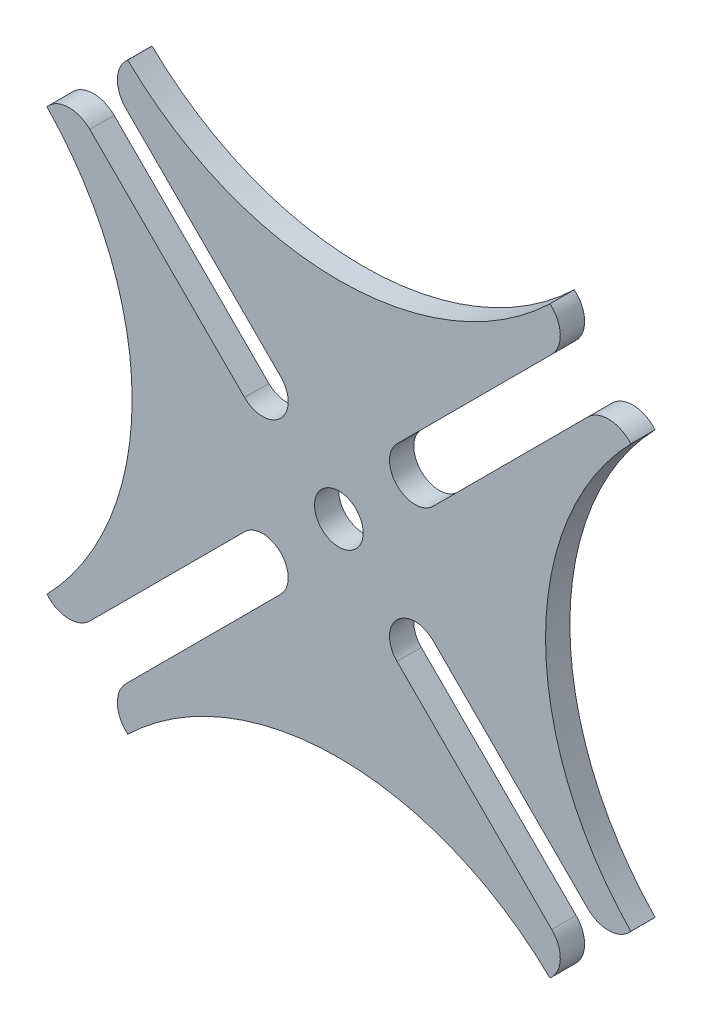
ISO-10303-21;
HEADER;
FILE_DESCRIPTION(('STEP AP214'),'2;1');
FILE_NAME('part.step','',(''),(''),'','','');
FILE_SCHEMA(('AUTOMOTIVE_DESIGN { 1 0 10303 214 1 1 1 1 }'));
ENDSEC;
DATA;
#1=APPLICATION_CONTEXT('core data for automotive mechanical design processes');
#2=APPLICATION_PROTOCOL_DEFINITION('international standard','automotive_design',2000,#1);
#3=PRODUCT_CONTEXT('',#1,'mechanical');
#4=PRODUCT('Part','Part','',(#3));
#5=PRODUCT_RELATED_PRODUCT_CATEGORY('part','',(#4));
#6=PRODUCT_DEFINITION_FORMATION('','',#4);
#7=PRODUCT_DEFINITION_CONTEXT('part definition',#1,'design');
#8=PRODUCT_DEFINITION('design','',#6,#7);
#9=PRODUCT_DEFINITION_SHAPE('','',#8);
#10=(LENGTH_UNIT() NAMED_UNIT(*) SI_UNIT(.MILLI.,.METRE.));
#11=(NAMED_UNIT(*) PLANE_ANGLE_UNIT() SI_UNIT($,.RADIAN.));
#12=(NAMED_UNIT(*) SI_UNIT($,.STERADIAN.) SOLID_ANGLE_UNIT());
#13=UNCERTAINTY_MEASURE_WITH_UNIT(LENGTH_MEASURE(1.E-05),#10,'distance_accuracy_value','');
#14=(GEOMETRIC_REPRESENTATION_CONTEXT(3) GLOBAL_UNCERTAINTY_ASSIGNED_CONTEXT((#13)) GLOBAL_UNIT_ASSIGNED_CONTEXT((#10,
#11,#12)) REPRESENTATION_CONTEXT('',''));
#15=CARTESIAN_POINT('',(0.,0.,0.));
#16=DIRECTION('',(0.,0.,1.));
#17=DIRECTION('',(1.,0.,0.));
#18=AXIS2_PLACEMENT_3D('',#15,#16,#17);
#19=CARTESIAN_POINT('',(105.,0.,5.));
#20=DIRECTION('',(0.,0.,1.));
#21=DIRECTION('',(1.,0.,0.));
#22=AXIS2_PLACEMENT_3D('',#19,#20,#21);
#23=PLANE('',#22);
#24=CARTESIAN_POINT('',(105.,0.,5.));
#25=DIRECTION('',(0.,0.,-1.));
#26=DIRECTION('',(1.,0.,0.));
#27=AXIS2_PLACEMENT_3D('',#24,#25,#26);
#28=CIRCLE('',#27,62.5);
#29=CARTESIAN_POINT('',(60.0266261974981,-43.4009867263457,5.));
#30=VERTEX_POINT('',#29);
#31=CARTESIAN_POINT('',(60.0266273466604,43.4009879171413,5.));
#32=VERTEX_POINT('',#31);
#33=EDGE_CURVE('E279',#30,#32,#28,.T.);
#34=ORIENTED_EDGE('',*,*,#33,.T.);
#35=CARTESIAN_POINT('',(55.4412378512341,39.5313363598,5.));
#36=DIRECTION('',(0.,0.,1.));
#37=DIRECTION('',(-1.,0.,0.));
#38=AXIS2_PLACEMENT_3D('',#35,#36,#37);
#39=CIRCLE('',#38,6.);
#40=CARTESIAN_POINT('',(51.1985971156337,43.7739769984381,5.));
#41=VERTEX_POINT('',#40);
#42=EDGE_CURVE('E147',#32,#41,#39,.T.);
#43=ORIENTED_EDGE('',*,*,#42,.T.);
#44=DIRECTION('',(-0.707106773106353,-0.707106789266742,0.));
#45=VECTOR('',#44,1.);
#46=CARTESIAN_POINT('',(19.3787923258478,11.9541714814347,5.));
#47=LINE('',#46,#45);
#48=CARTESIAN_POINT('',(19.3787923258478,11.9541714814347,5.));
#49=VERTEX_POINT('',#48);
#50=EDGE_CURVE('E342',#41,#49,#47,.T.);
#51=ORIENTED_EDGE('',*,*,#50,.T.);
#52=CARTESIAN_POINT('',(15.6664816821974,15.666482040243,5.));
#53=DIRECTION('',(0.,0.,-1.));
#54=DIRECTION('',(1.,0.,0.));
#55=AXIS2_PLACEMENT_3D('',#52,#53,#54);
#56=CIRCLE('',#55,5.24999999999995);
#57=CARTESIAN_POINT('',(11.9541710385471,19.3787925990513,5.));
#58=VERTEX_POINT('',#57);
#59=EDGE_CURVE('E361',#49,#58,#56,.T.);
#60=ORIENTED_EDGE('',*,*,#59,.T.);
#61=DIRECTION('',(0.707106773106353,0.707106789266742,0.));
#62=VECTOR('',#61,1.);
#63=CARTESIAN_POINT('',(11.9541710385471,19.3787925990513,5.));
#64=LINE('',#63,#62);
#65=CARTESIAN_POINT('',(43.773975828333,51.1985981160547,5.));
#66=VERTEX_POINT('',#65);
#67=EDGE_CURVE('E358',#58,#66,#64,.T.);
#68=ORIENTED_EDGE('',*,*,#67,.T.);
#69=CARTESIAN_POINT('',(39.5313350927325,55.4412387546928,5.));
#70=DIRECTION('',(0.,0.,1.));
#71=DIRECTION('',(1.,0.,0.));
#72=AXIS2_PLACEMENT_3D('',#69,#70,#71);
#73=CIRCLE('',#72,6.);
#74=CARTESIAN_POINT('',(43.4009865452783,60.0266283385571,5.));
#75=VERTEX_POINT('',#74);
#76=EDGE_CURVE('E360',#66,#75,#73,.T.);
#77=ORIENTED_EDGE('',*,*,#76,.T.);
#78=CARTESIAN_POINT('',(-2.24129753054683E-07,105.000000941604,5.));
#79=DIRECTION('',(0.,0.,-1.));
#80=DIRECTION('',(1.,0.,0.));
#81=AXIS2_PLACEMENT_3D('',#78,#79,#80);
#82=CIRCLE('',#81,62.4999991668067);
#83=CARTESIAN_POINT('',(-43.4009859439844,60.0266273256988,5.));
#84=VERTEX_POINT('',#83);
#85=EDGE_CURVE('E363',#75,#84,#82,.T.);
#86=ORIENTED_EDGE('',*,*,#85,.T.);
#87=CARTESIAN_POINT('',(-39.5313354453696,55.4412369368039,5.));
#88=DIRECTION('',(0.,0.,1.));
#89=DIRECTION('',(-1.,0.,0.));
#90=AXIS2_PLACEMENT_3D('',#87,#88,#89);
#91=CIRCLE('',#90,6.00000000000002);
#92=CARTESIAN_POINT('',(-43.7739760198867,51.1985961370824,5.));
#93=VERTEX_POINT('',#92);
#94=EDGE_CURVE('E369',#84,#93,#91,.T.);
#95=ORIENTED_EDGE('',*,*,#94,.T.);
#96=DIRECTION('',(0.707106789266742,-0.707106773106353,0.));
#97=VECTOR('',#96,1.);
#98=CARTESIAN_POINT('',(-11.9541705028833,19.3787913472965,5.));
#99=LINE('',#98,#97);
#100=CARTESIAN_POINT('',(-11.9541705028833,19.3787913472965,5.));
#101=VERTEX_POINT('',#100);
#102=EDGE_CURVE('E371',#93,#101,#99,.T.);
#103=ORIENTED_EDGE('',*,*,#102,.T.);
#104=CARTESIAN_POINT('',(-15.6664823982886,15.666482040243,5.));
#105=DIRECTION('',(0.,0.,-1.));
#106=DIRECTION('',(1.,0.,0.));
#107=AXIS2_PLACEMENT_3D('',#104,#105,#106);
#108=CIRCLE('',#107,5.25000000000032);
#109=CARTESIAN_POINT('',(-19.3787916205,11.9541700599957,5.));
#110=VERTEX_POINT('',#109);
#111=EDGE_CURVE('E373',#101,#110,#108,.T.);
#112=ORIENTED_EDGE('',*,*,#111,.T.);
#113=DIRECTION('',(-0.707106789266742,0.707106773106353,0.));
#114=VECTOR('',#113,1.);
#115=CARTESIAN_POINT('',(-19.3787916205,11.9541700599957,5.));
#116=LINE('',#115,#114);
#117=CARTESIAN_POINT('',(-51.1985970377725,43.7739747500507,5.));
#118=VERTEX_POINT('',#117);
#119=EDGE_CURVE('E375',#110,#118,#116,.T.);
#120=ORIENTED_EDGE('',*,*,#119,.T.);
#121=CARTESIAN_POINT('',(-55.4412376764107,39.5313340144503,5.));
#122=DIRECTION('',(0.,0.,1.));
#123=DIRECTION('',(1.,0.,0.));
#124=AXIS2_PLACEMENT_3D('',#121,#122,#123);
#125=CIRCLE('',#124,6.00000000000002);
#126=CARTESIAN_POINT('',(-60.0266261974981,43.4009867263457,5.));
#127=VERTEX_POINT('',#126);
#128=EDGE_CURVE('E377',#118,#127,#125,.T.);
#129=ORIENTED_EDGE('',*,*,#128,.T.);
#130=CARTESIAN_POINT('',(-105.,0.,5.));
#131=DIRECTION('',(0.,0.,-1.));
#132=DIRECTION('',(1.,0.,0.));
#133=AXIS2_PLACEMENT_3D('',#130,#131,#132);
#134=CIRCLE('',#133,62.5);
#135=CARTESIAN_POINT('',(-60.0266264046898,-43.4009869410438,5.));
#136=VERTEX_POINT('',#135);
#137=EDGE_CURVE('E379',#127,#136,#134,.T.);
#138=ORIENTED_EDGE('',*,*,#137,.T.);
#139=CARTESIAN_POINT('',(-55.4412368936445,-39.5313354022102,5.));
#140=DIRECTION('',(0.,0.,1.));
#141=DIRECTION('',(-1.,0.,0.));
#142=AXIS2_PLACEMENT_3D('',#139,#140,#141);
#143=CIRCLE('',#142,6.00000000000001);
#144=CARTESIAN_POINT('',(-51.198596158044,-43.7739760408483,5.));
#145=VERTEX_POINT('',#144);
#146=EDGE_CURVE('E381',#136,#145,#143,.T.);
#147=ORIENTED_EDGE('',*,*,#146,.T.);
#148=DIRECTION('',(0.707106773106353,0.707106789266742,0.));
#149=VECTOR('',#148,1.);
#150=CARTESIAN_POINT('',(-19.3787913682582,-11.954170523845,5.));
#151=LINE('',#150,#149);
#152=CARTESIAN_POINT('',(-19.3787913682582,-11.954170523845,5.));
#153=VERTEX_POINT('',#152);
#154=EDGE_CURVE('E383',#145,#153,#151,.T.);
#155=ORIENTED_EDGE('',*,*,#154,.T.);
#156=CARTESIAN_POINT('',(-15.6664811259639,-15.6664813241519,5.));
#157=DIRECTION('',(0.,0.,-1.));
#158=DIRECTION('',(1.,0.,0.));
#159=AXIS2_PLACEMENT_3D('',#156,#157,#158);
#160=CIRCLE('',#159,5.24999988696369);
#161=CARTESIAN_POINT('',(-11.9541708484353,-19.3787920892246,5.));
#162=VERTEX_POINT('',#161);
#163=EDGE_CURVE('E385',#153,#162,#160,.T.);
#164=ORIENTED_EDGE('',*,*,#163,.T.);
#165=DIRECTION('',(-0.707106773106353,-0.707106789266742,0.));
#166=VECTOR('',#165,1.);
#167=CARTESIAN_POINT('',(-11.9541708484353,-19.3787920892246,5.));
#168=LINE('',#167,#166);
#169=CARTESIAN_POINT('',(-43.7739756382212,-51.1985976062279,5.));
#170=VERTEX_POINT('',#169);
#171=EDGE_CURVE('E387',#162,#170,#168,.T.);
#172=ORIENTED_EDGE('',*,*,#171,.T.);
#173=CARTESIAN_POINT('',(-39.5313348614211,-55.4412382036665,5.));
#174=DIRECTION('',(0.,0.,1.));
#175=DIRECTION('',(1.,0.,0.));
#176=AXIS2_PLACEMENT_3D('',#173,#174,#175);
#177=CIRCLE('',#176,6.00000000000002);
#178=CARTESIAN_POINT('',(-43.4009863718929,-60.0266277386465,5.));
#179=VERTEX_POINT('',#178);
#180=EDGE_CURVE('E389',#170,#179,#177,.T.);
#181=ORIENTED_EDGE('',*,*,#180,.T.);
#182=CARTESIAN_POINT('',(-2.24129753054683E-07,-105.000000941604,5.));
#183=DIRECTION('',(0.,0.,-1.));
#184=DIRECTION('',(1.,0.,0.));
#185=AXIS2_PLACEMENT_3D('',#182,#183,#184);
#186=CIRCLE('',#185,62.4999991668067);
#187=CARTESIAN_POINT('',(43.4009861383314,-60.0266279458381,5.));
#188=VERTEX_POINT('',#187);
#189=EDGE_CURVE('E391',#179,#188,#186,.T.);
#190=ORIENTED_EDGE('',*,*,#189,.T.);
#191=CARTESIAN_POINT('',(39.5313352203379,-55.4412379108605,5.));
#192=DIRECTION('',(0.,0.,1.));
#193=DIRECTION('',(-1.,0.,0.));
#194=AXIS2_PLACEMENT_3D('',#191,#192,#193);
#195=CIRCLE('',#194,6.00000000000002);
#196=CARTESIAN_POINT('',(43.7739760408483,-51.1985973571323,5.));
#197=VERTEX_POINT('',#196);
#198=EDGE_CURVE('E393',#188,#197,#195,.T.);
#199=ORIENTED_EDGE('',*,*,#198,.T.);
#200=DIRECTION('',(-0.707106789266742,0.707106773106353,0.));
#201=VECTOR('',#200,1.);
#202=CARTESIAN_POINT('',(11.9541705238449,-19.3787925673464,5.));
#203=LINE('',#202,#201);
#204=CARTESIAN_POINT('',(11.9541705238449,-19.3787925673464,5.));
#205=VERTEX_POINT('',#204);
#206=EDGE_CURVE('E214',#197,#205,#203,.T.);
#207=ORIENTED_EDGE('',*,*,#206,.T.);
#208=CARTESIAN_POINT('',(15.6664816821974,-15.6664813241519,5.));
#209=DIRECTION('',(0.,0.,-1.));
#210=DIRECTION('',(1.,0.,0.));
#211=AXIS2_PLACEMENT_3D('',#208,#209,#210);
#212=CIRCLE('',#211,5.25000084788346);
#213=CARTESIAN_POINT('',(19.3787928405499,-11.9541700809573,5.));
#214=VERTEX_POINT('',#213);
#215=EDGE_CURVE('E208',#205,#214,#212,.T.);
#216=ORIENTED_EDGE('',*,*,#215,.T.);
#217=DIRECTION('',(0.707106789266742,-0.707106773106353,0.));
#218=VECTOR('',#217,1.);
#219=CARTESIAN_POINT('',(19.3787928405499,-11.9541700809573,5.));
#220=LINE('',#219,#218);
#221=CARTESIAN_POINT('',(51.1985976880693,-43.7739742012592,5.));
#222=VERTEX_POINT('',#221);
#223=EDGE_CURVE('E212',#214,#222,#220,.T.);
#224=ORIENTED_EDGE('',*,*,#223,.T.);
#225=CARTESIAN_POINT('',(55.4412382252022,-39.5313333641536,5.));
#226=DIRECTION('',(0.,0.,1.));
#227=DIRECTION('',(1.,0.,0.));
#228=AXIS2_PLACEMENT_3D('',#225,#226,#227);
#229=CIRCLE('',#228,5.99999999999997);
#230=EDGE_CURVE('E56',#222,#30,#229,.T.);
#231=ORIENTED_EDGE('',*,*,#230,.T.);
#232=EDGE_LOOP('',(#34,#43,#51,#60,#68,#77,#86,#95,#103,#112,#120,#129,#138,#147,#155,#164,#172,
#181,#190,#199,#207,#216,#224,#231));
#233=FACE_BOUND('',#232,.T.);
#234=CARTESIAN_POINT('',(0.,0.,5.));
#235=DIRECTION('',(0.,0.,1.));
#236=DIRECTION('',(1.,0.,0.));
#237=AXIS2_PLACEMENT_3D('',#234,#235,#236);
#238=CIRCLE('',#237,5.);
#239=CARTESIAN_POINT('',(5.,0.,5.));
#240=VERTEX_POINT('',#239);
#241=EDGE_CURVE('E236',#240,#240,#238,.T.);
#242=ORIENTED_EDGE('',*,*,#241,.F.);
#243=EDGE_LOOP('',(#242));
#244=FACE_BOUND('',#243,.T.);
#245=ADVANCED_FACE('F39',(#233,#244),#23,.T.);
#246=CARTESIAN_POINT('',(105.,0.,0.));
#247=DIRECTION('',(0.,0.,1.));
#248=DIRECTION('',(1.,0.,0.));
#249=AXIS2_PLACEMENT_3D('',#246,#247,#248);
#250=PLANE('',#249);
#251=CARTESIAN_POINT('',(105.,0.,0.));
#252=DIRECTION('',(0.,0.,-1.));
#253=DIRECTION('',(1.,0.,0.));
#254=AXIS2_PLACEMENT_3D('',#251,#252,#253);
#255=CIRCLE('',#254,62.5);
#256=CARTESIAN_POINT('',(60.0266261974981,-43.4009867263457,0.));
#257=VERTEX_POINT('',#256);
#258=CARTESIAN_POINT('',(60.0266273466604,43.4009879171413,0.));
#259=VERTEX_POINT('',#258);
#260=EDGE_CURVE('E232',#257,#259,#255,.T.);
#261=ORIENTED_EDGE('',*,*,#260,.F.);
#262=CARTESIAN_POINT('',(55.4412382252022,-39.5313333641536,0.));
#263=DIRECTION('',(0.,0.,1.));
#264=DIRECTION('',(1.,0.,0.));
#265=AXIS2_PLACEMENT_3D('',#262,#263,#264);
#266=CIRCLE('',#265,5.99999999999997);
#267=CARTESIAN_POINT('',(51.1985976880693,-43.7739742012592,0.));
#268=VERTEX_POINT('',#267);
#269=EDGE_CURVE('E139',#268,#257,#266,.T.);
#270=ORIENTED_EDGE('',*,*,#269,.F.);
#271=DIRECTION('',(0.707106789266742,-0.707106773106353,0.));
#272=VECTOR('',#271,1.);
#273=CARTESIAN_POINT('',(19.3787928405499,-11.9541700809573,0.));
#274=LINE('',#273,#272);
#275=CARTESIAN_POINT('',(19.3787928405499,-11.9541700809573,0.));
#276=VERTEX_POINT('',#275);
#277=EDGE_CURVE('E133',#276,#268,#274,.T.);
#278=ORIENTED_EDGE('',*,*,#277,.F.);
#279=CARTESIAN_POINT('',(15.6664816821974,-15.6664813241519,0.));
#280=DIRECTION('',(0.,0.,-1.));
#281=DIRECTION('',(1.,0.,0.));
#282=AXIS2_PLACEMENT_3D('',#279,#280,#281);
#283=CIRCLE('',#282,5.25000084788346);
#284=CARTESIAN_POINT('',(11.9541705238449,-19.3787925673464,0.));
#285=VERTEX_POINT('',#284);
#286=EDGE_CURVE('E222',#285,#276,#283,.T.);
#287=ORIENTED_EDGE('',*,*,#286,.F.);
#288=DIRECTION('',(-0.707106789266742,0.707106773106353,0.));
#289=VECTOR('',#288,1.);
#290=CARTESIAN_POINT('',(11.9541705238449,-19.3787925673464,0.));
#291=LINE('',#290,#289);
#292=CARTESIAN_POINT('',(43.7739760408483,-51.1985973571323,0.));
#293=VERTEX_POINT('',#292);
#294=EDGE_CURVE('E274',#293,#285,#291,.T.);
#295=ORIENTED_EDGE('',*,*,#294,.F.);
#296=CARTESIAN_POINT('',(39.5313352203379,-55.4412379108605,0.));
#297=DIRECTION('',(0.,0.,1.));
#298=DIRECTION('',(-1.,0.,0.));
#299=AXIS2_PLACEMENT_3D('',#296,#297,#298);
#300=CIRCLE('',#299,6.00000000000002);
#301=CARTESIAN_POINT('',(43.4009861383314,-60.0266279458381,0.));
#302=VERTEX_POINT('',#301);
#303=EDGE_CURVE('E272',#302,#293,#300,.T.);
#304=ORIENTED_EDGE('',*,*,#303,.F.);
#305=CARTESIAN_POINT('',(-2.24129753054683E-07,-105.000000941604,0.));
#306=DIRECTION('',(0.,0.,-1.));
#307=DIRECTION('',(1.,0.,0.));
#308=AXIS2_PLACEMENT_3D('',#305,#306,#307);
#309=CIRCLE('',#308,62.4999991668067);
#310=CARTESIAN_POINT('',(-43.4009863718929,-60.0266277386465,0.));
#311=VERTEX_POINT('',#310);
#312=EDGE_CURVE('E270',#311,#302,#309,.T.);
#313=ORIENTED_EDGE('',*,*,#312,.F.);
#314=CARTESIAN_POINT('',(-39.5313348614211,-55.4412382036665,0.));
#315=DIRECTION('',(0.,0.,1.));
#316=DIRECTION('',(1.,0.,0.));
#317=AXIS2_PLACEMENT_3D('',#314,#315,#316);
#318=CIRCLE('',#317,6.00000000000002);
#319=CARTESIAN_POINT('',(-43.7739756382212,-51.1985976062279,0.));
#320=VERTEX_POINT('',#319);
#321=EDGE_CURVE('E268',#320,#311,#318,.T.);
#322=ORIENTED_EDGE('',*,*,#321,.F.);
#323=DIRECTION('',(-0.707106773106353,-0.707106789266742,0.));
#324=VECTOR('',#323,1.);
#325=CARTESIAN_POINT('',(-11.9541708484353,-19.3787920892246,0.));
#326=LINE('',#325,#324);
#327=CARTESIAN_POINT('',(-11.9541708484353,-19.3787920892246,0.));
#328=VERTEX_POINT('',#327);
#329=EDGE_CURVE('E266',#328,#320,#326,.T.);
#330=ORIENTED_EDGE('',*,*,#329,.F.);
#331=CARTESIAN_POINT('',(-15.6664811259639,-15.6664813241519,0.));
#332=DIRECTION('',(0.,0.,-1.));
#333=DIRECTION('',(1.,0.,0.));
#334=AXIS2_PLACEMENT_3D('',#331,#332,#333);
#335=CIRCLE('',#334,5.24999988696369);
#336=CARTESIAN_POINT('',(-19.3787913682582,-11.954170523845,0.));
#337=VERTEX_POINT('',#336);
#338=EDGE_CURVE('E264',#337,#328,#335,.T.);
#339=ORIENTED_EDGE('',*,*,#338,.F.);
#340=DIRECTION('',(0.707106773106353,0.707106789266742,0.));
#341=VECTOR('',#340,1.);
#342=CARTESIAN_POINT('',(-19.3787913682582,-11.954170523845,0.));
#343=LINE('',#342,#341);
#344=CARTESIAN_POINT('',(-51.198596158044,-43.7739760408483,0.));
#345=VERTEX_POINT('',#344);
#346=EDGE_CURVE('E262',#345,#337,#343,.T.);
#347=ORIENTED_EDGE('',*,*,#346,.F.);
#348=CARTESIAN_POINT('',(-55.4412368936445,-39.5313354022102,0.));
#349=DIRECTION('',(0.,0.,1.));
#350=DIRECTION('',(-1.,0.,0.));
#351=AXIS2_PLACEMENT_3D('',#348,#349,#350);
#352=CIRCLE('',#351,6.00000000000001);
#353=CARTESIAN_POINT('',(-60.0266264046898,-43.4009869410438,0.));
#354=VERTEX_POINT('',#353);
#355=EDGE_CURVE('E260',#354,#345,#352,.T.);
#356=ORIENTED_EDGE('',*,*,#355,.F.);
#357=CARTESIAN_POINT('',(-105.,0.,0.));
#358=DIRECTION('',(0.,0.,-1.));
#359=DIRECTION('',(1.,0.,0.));
#360=AXIS2_PLACEMENT_3D('',#357,#358,#359);
#361=CIRCLE('',#360,62.5);
#362=CARTESIAN_POINT('',(-60.0266261974981,43.4009867263457,0.));
#363=VERTEX_POINT('',#362);
#364=EDGE_CURVE('E258',#363,#354,#361,.T.);
#365=ORIENTED_EDGE('',*,*,#364,.F.);
#366=CARTESIAN_POINT('',(-55.4412376764107,39.5313340144503,0.));
#367=DIRECTION('',(0.,0.,1.));
#368=DIRECTION('',(1.,0.,0.));
#369=AXIS2_PLACEMENT_3D('',#366,#367,#368);
#370=CIRCLE('',#369,6.00000000000002);
#371=CARTESIAN_POINT('',(-51.1985970377725,43.7739747500507,0.));
#372=VERTEX_POINT('',#371);
#373=EDGE_CURVE('E256',#372,#363,#370,.T.);
#374=ORIENTED_EDGE('',*,*,#373,.F.);
#375=DIRECTION('',(-0.707106789266742,0.707106773106353,0.));
#376=VECTOR('',#375,1.);
#377=CARTESIAN_POINT('',(-19.3787916205,11.9541700599957,0.));
#378=LINE('',#377,#376);
#379=CARTESIAN_POINT('',(-19.3787916205,11.9541700599957,0.));
#380=VERTEX_POINT('',#379);
#381=EDGE_CURVE('E254',#380,#372,#378,.T.);
#382=ORIENTED_EDGE('',*,*,#381,.F.);
#383=CARTESIAN_POINT('',(-15.6664823982886,15.666482040243,0.));
#384=DIRECTION('',(0.,0.,-1.));
#385=DIRECTION('',(1.,0.,0.));
#386=AXIS2_PLACEMENT_3D('',#383,#384,#385);
#387=CIRCLE('',#386,5.25000000000032);
#388=CARTESIAN_POINT('',(-11.9541705028833,19.3787913472965,0.));
#389=VERTEX_POINT('',#388);
#390=EDGE_CURVE('E252',#389,#380,#387,.T.);
#391=ORIENTED_EDGE('',*,*,#390,.F.);
#392=DIRECTION('',(0.707106789266742,-0.707106773106353,0.));
#393=VECTOR('',#392,1.);
#394=CARTESIAN_POINT('',(-11.9541705028833,19.3787913472965,0.));
#395=LINE('',#394,#393);
#396=CARTESIAN_POINT('',(-43.7739760198867,51.1985961370824,0.));
#397=VERTEX_POINT('',#396);
#398=EDGE_CURVE('E250',#397,#389,#395,.T.);
#399=ORIENTED_EDGE('',*,*,#398,.F.);
#400=CARTESIAN_POINT('',(-39.5313354453696,55.4412369368039,0.));
#401=DIRECTION('',(0.,0.,1.));
#402=DIRECTION('',(-1.,0.,0.));
#403=AXIS2_PLACEMENT_3D('',#400,#401,#402);
#404=CIRCLE('',#403,6.00000000000002);
#405=CARTESIAN_POINT('',(-43.4009859439844,60.0266273256988,0.));
#406=VERTEX_POINT('',#405);
#407=EDGE_CURVE('E248',#406,#397,#404,.T.);
#408=ORIENTED_EDGE('',*,*,#407,.F.);
#409=CARTESIAN_POINT('',(-2.24129753054683E-07,105.000000941604,0.));
#410=DIRECTION('',(0.,0.,-1.));
#411=DIRECTION('',(1.,0.,0.));
#412=AXIS2_PLACEMENT_3D('',#409,#410,#411);
#413=CIRCLE('',#412,62.4999991668067);
#414=CARTESIAN_POINT('',(43.4009865452783,60.0266283385571,0.));
#415=VERTEX_POINT('',#414);
#416=EDGE_CURVE('E246',#415,#406,#413,.T.);
#417=ORIENTED_EDGE('',*,*,#416,.F.);
#418=CARTESIAN_POINT('',(39.5313350927325,55.4412387546928,0.));
#419=DIRECTION('',(0.,0.,1.));
#420=DIRECTION('',(1.,0.,0.));
#421=AXIS2_PLACEMENT_3D('',#418,#419,#420);
#422=CIRCLE('',#421,6.);
#423=CARTESIAN_POINT('',(43.773975828333,51.1985981160547,0.));
#424=VERTEX_POINT('',#423);
#425=EDGE_CURVE('E244',#424,#415,#422,.T.);
#426=ORIENTED_EDGE('',*,*,#425,.F.);
#427=DIRECTION('',(0.707106773106353,0.707106789266742,0.));
#428=VECTOR('',#427,1.);
#429=CARTESIAN_POINT('',(11.9541710385471,19.3787925990513,0.));
#430=LINE('',#429,#428);
#431=CARTESIAN_POINT('',(11.9541710385471,19.3787925990513,0.));
#432=VERTEX_POINT('',#431);
#433=EDGE_CURVE('E242',#432,#424,#430,.T.);
#434=ORIENTED_EDGE('',*,*,#433,.F.);
#435=CARTESIAN_POINT('',(15.6664816821974,15.666482040243,0.));
#436=DIRECTION('',(0.,0.,-1.));
#437=DIRECTION('',(1.,0.,0.));
#438=AXIS2_PLACEMENT_3D('',#435,#436,#437);
#439=CIRCLE('',#438,5.24999999999995);
#440=CARTESIAN_POINT('',(19.3787923258478,11.9541714814347,0.));
#441=VERTEX_POINT('',#440);
#442=EDGE_CURVE('E240',#441,#432,#439,.T.);
#443=ORIENTED_EDGE('',*,*,#442,.F.);
#444=DIRECTION('',(-0.707106773106353,-0.707106789266742,0.));
#445=VECTOR('',#444,1.);
#446=CARTESIAN_POINT('',(19.3787923258478,11.9541714814347,0.));
#447=LINE('',#446,#445);
#448=CARTESIAN_POINT('',(51.1985971156337,43.7739769984381,0.));
#449=VERTEX_POINT('',#448);
#450=EDGE_CURVE('E238',#449,#441,#447,.T.);
#451=ORIENTED_EDGE('',*,*,#450,.F.);
#452=CARTESIAN_POINT('',(55.4412378512341,39.5313363598,0.));
#453=DIRECTION('',(0.,0.,1.));
#454=DIRECTION('',(-1.,0.,0.));
#455=AXIS2_PLACEMENT_3D('',#452,#453,#454);
#456=CIRCLE('',#455,6.);
#457=EDGE_CURVE('E235',#259,#449,#456,.T.);
#458=ORIENTED_EDGE('',*,*,#457,.F.);
#459=EDGE_LOOP('',(#261,#270,#278,#287,#295,#304,#313,#322,#330,#339,#347,#356,#365,#374,#382,
#391,#399,#408,#417,#426,#434,#443,#451,#458));
#460=FACE_BOUND('',#459,.T.);
#461=CARTESIAN_POINT('',(0.,0.,0.));
#462=DIRECTION('',(0.,0.,1.));
#463=DIRECTION('',(1.,0.,0.));
#464=AXIS2_PLACEMENT_3D('',#461,#462,#463);
#465=CIRCLE('',#464,5.);
#466=CARTESIAN_POINT('',(5.,0.,0.));
#467=VERTEX_POINT('',#466);
#468=EDGE_CURVE('E642',#467,#467,#465,.T.);
#469=ORIENTED_EDGE('',*,*,#468,.T.);
#470=EDGE_LOOP('',(#469));
#471=FACE_BOUND('',#470,.T.);
#472=ADVANCED_FACE('F346',(#460,#471),#250,.F.);
#473=CARTESIAN_POINT('',(105.,0.,5.));
#474=DIRECTION('',(0.,0.,-1.));
#475=DIRECTION('',(-1.,0.,0.));
#476=AXIS2_PLACEMENT_3D('',#473,#474,#475);
#477=CYLINDRICAL_SURFACE('',#476,62.5);
#478=ORIENTED_EDGE('',*,*,#260,.T.);
#479=DIRECTION('',(0.,0.,-1.));
#480=VECTOR('',#479,1.);
#481=CARTESIAN_POINT('',(60.0266273466604,43.4009879171413,5.));
#482=LINE('',#481,#480);
#483=EDGE_CURVE('E11',#32,#259,#482,.T.);
#484=ORIENTED_EDGE('',*,*,#483,.F.);
#485=ORIENTED_EDGE('',*,*,#33,.F.);
#486=DIRECTION('',(0.,0.,-1.));
#487=VECTOR('',#486,1.);
#488=CARTESIAN_POINT('',(60.0266261974981,-43.4009867263457,5.));
#489=LINE('',#488,#487);
#490=EDGE_CURVE('E228',#30,#257,#489,.T.);
#491=ORIENTED_EDGE('',*,*,#490,.T.);
#492=EDGE_LOOP('',(#478,#484,#485,#491));
#493=FACE_BOUND('',#492,.T.);
#494=ADVANCED_FACE('F41',(#493),#477,.F.);
#495=CARTESIAN_POINT('',(55.4412378512341,39.5313363598,5.));
#496=DIRECTION('',(0.,0.,-1.));
#497=DIRECTION('',(-1.,0.,0.));
#498=AXIS2_PLACEMENT_3D('',#495,#496,#497);
#499=CYLINDRICAL_SURFACE('',#498,6.);
#500=ORIENTED_EDGE('',*,*,#457,.T.);
#501=DIRECTION('',(0.,0.,-1.));
#502=VECTOR('',#501,1.);
#503=CARTESIAN_POINT('',(51.1985971156337,43.7739769984381,5.));
#504=LINE('',#503,#502);
#505=EDGE_CURVE('E48',#41,#449,#504,.T.);
#506=ORIENTED_EDGE('',*,*,#505,.F.);
#507=ORIENTED_EDGE('',*,*,#42,.F.);
#508=ORIENTED_EDGE('',*,*,#483,.T.);
#509=EDGE_LOOP('',(#500,#506,#507,#508));
#510=FACE_BOUND('',#509,.T.);
#511=ADVANCED_FACE('F427',(#510),#499,.T.);
#512=CARTESIAN_POINT('',(19.3787923258478,11.9541714814347,5.));
#513=DIRECTION('',(0.707106789266742,-0.707106773106353,0.));
#514=DIRECTION('',(0.707106773106353,0.707106789266742,0.));
#515=AXIS2_PLACEMENT_3D('',#512,#513,#514);
#516=PLANE('',#515);
#517=ORIENTED_EDGE('',*,*,#450,.T.);
#518=DIRECTION('',(0.,0.,-1.));
#519=VECTOR('',#518,1.);
#520=CARTESIAN_POINT('',(19.3787923258478,11.9541714814347,5.));
#521=LINE('',#520,#519);
#522=EDGE_CURVE('E334',#49,#441,#521,.T.);
#523=ORIENTED_EDGE('',*,*,#522,.F.);
#524=ORIENTED_EDGE('',*,*,#50,.F.);
#525=ORIENTED_EDGE('',*,*,#505,.T.);
#526=EDGE_LOOP('',(#517,#523,#524,#525));
#527=FACE_BOUND('',#526,.T.);
#528=ADVANCED_FACE('F340',(#527),#516,.F.);
#529=CARTESIAN_POINT('',(15.6664816821974,15.666482040243,5.));
#530=DIRECTION('',(0.,0.,-1.));
#531=DIRECTION('',(-1.,0.,0.));
#532=AXIS2_PLACEMENT_3D('',#529,#530,#531);
#533=CYLINDRICAL_SURFACE('',#532,5.24999999999995);
#534=ORIENTED_EDGE('',*,*,#442,.T.);
#535=DIRECTION('',(0.,0.,-1.));
#536=VECTOR('',#535,1.);
#537=CARTESIAN_POINT('',(11.9541710385471,19.3787925990513,5.));
#538=LINE('',#537,#536);
#539=EDGE_CURVE('E331',#58,#432,#538,.T.);
#540=ORIENTED_EDGE('',*,*,#539,.F.);
#541=ORIENTED_EDGE('',*,*,#59,.F.);
#542=ORIENTED_EDGE('',*,*,#522,.T.);
#543=EDGE_LOOP('',(#534,#540,#541,#542));
#544=FACE_BOUND('',#543,.T.);
#545=ADVANCED_FACE('F352',(#544),#533,.F.);
#546=CARTESIAN_POINT('',(11.9541710385471,19.3787925990513,5.));
#547=DIRECTION('',(-0.707106789266742,0.707106773106353,0.));
#548=DIRECTION('',(-0.707106773106353,-0.707106789266742,0.));
#549=AXIS2_PLACEMENT_3D('',#546,#547,#548);
#550=PLANE('',#549);
#551=ORIENTED_EDGE('',*,*,#433,.T.);
#552=DIRECTION('',(0.,0.,-1.));
#553=VECTOR('',#552,1.);
#554=CARTESIAN_POINT('',(43.773975828333,51.1985981160547,5.));
#555=LINE('',#554,#553);
#556=EDGE_CURVE('E328',#66,#424,#555,.T.);
#557=ORIENTED_EDGE('',*,*,#556,.F.);
#558=ORIENTED_EDGE('',*,*,#67,.F.);
#559=ORIENTED_EDGE('',*,*,#539,.T.);
#560=EDGE_LOOP('',(#551,#557,#558,#559));
#561=FACE_BOUND('',#560,.T.);
#562=ADVANCED_FACE('F356',(#561),#550,.F.);
#563=CARTESIAN_POINT('',(39.5313350927325,55.4412387546928,5.));
#564=DIRECTION('',(0.,0.,-1.));
#565=DIRECTION('',(-1.,0.,0.));
#566=AXIS2_PLACEMENT_3D('',#563,#564,#565);
#567=CYLINDRICAL_SURFACE('',#566,6.);
#568=ORIENTED_EDGE('',*,*,#425,.T.);
#569=DIRECTION('',(0.,0.,-1.));
#570=VECTOR('',#569,1.);
#571=CARTESIAN_POINT('',(43.4009865452783,60.0266283385571,5.));
#572=LINE('',#571,#570);
#573=EDGE_CURVE('E325',#75,#415,#572,.T.);
#574=ORIENTED_EDGE('',*,*,#573,.F.);
#575=ORIENTED_EDGE('',*,*,#76,.F.);
#576=ORIENTED_EDGE('',*,*,#556,.T.);
#577=EDGE_LOOP('',(#568,#574,#575,#576));
#578=FACE_BOUND('',#577,.T.);
#579=ADVANCED_FACE('F440',(#578),#567,.T.);
#580=CARTESIAN_POINT('',(-2.24129753054683E-07,105.000000941604,5.));
#581=DIRECTION('',(0.,0.,-1.));
#582=DIRECTION('',(-1.,0.,0.));
#583=AXIS2_PLACEMENT_3D('',#580,#581,#582);
#584=CYLINDRICAL_SURFACE('',#583,62.4999991668067);
#585=ORIENTED_EDGE('',*,*,#416,.T.);
#586=DIRECTION('',(0.,0.,-1.));
#587=VECTOR('',#586,1.);
#588=CARTESIAN_POINT('',(-43.4009859439844,60.0266273256988,5.));
#589=LINE('',#588,#587);
#590=EDGE_CURVE('E322',#84,#406,#589,.T.);
#591=ORIENTED_EDGE('',*,*,#590,.F.);
#592=ORIENTED_EDGE('',*,*,#85,.F.);
#593=ORIENTED_EDGE('',*,*,#573,.T.);
#594=EDGE_LOOP('',(#585,#591,#592,#593));
#595=FACE_BOUND('',#594,.T.);
#596=ADVANCED_FACE('F443',(#595),#584,.F.);
#597=CARTESIAN_POINT('',(-39.5313354453696,55.4412369368039,5.));
#598=DIRECTION('',(0.,0.,-1.));
#599=DIRECTION('',(-1.,0.,0.));
#600=AXIS2_PLACEMENT_3D('',#597,#598,#599);
#601=CYLINDRICAL_SURFACE('',#600,6.00000000000002);
#602=ORIENTED_EDGE('',*,*,#407,.T.);
#603=DIRECTION('',(0.,0.,-1.));
#604=VECTOR('',#603,1.);
#605=CARTESIAN_POINT('',(-43.7739760198867,51.1985961370824,5.));
#606=LINE('',#605,#604);
#607=EDGE_CURVE('E319',#93,#397,#606,.T.);
#608=ORIENTED_EDGE('',*,*,#607,.F.);
#609=ORIENTED_EDGE('',*,*,#94,.F.);
#610=ORIENTED_EDGE('',*,*,#590,.T.);
#611=EDGE_LOOP('',(#602,#608,#609,#610));
#612=FACE_BOUND('',#611,.T.);
#613=ADVANCED_FACE('F447',(#612),#601,.T.);
#614=CARTESIAN_POINT('',(-11.9541705028833,19.3787913472965,5.));
#615=DIRECTION('',(0.707106773106353,0.707106789266742,0.));
#616=DIRECTION('',(-0.707106789266742,0.707106773106353,0.));
#617=AXIS2_PLACEMENT_3D('',#614,#615,#616);
#618=PLANE('',#617);
#619=ORIENTED_EDGE('',*,*,#398,.T.);
#620=DIRECTION('',(0.,0.,-1.));
#621=VECTOR('',#620,1.);
#622=CARTESIAN_POINT('',(-11.9541705028833,19.3787913472965,5.));
#623=LINE('',#622,#621);
#624=EDGE_CURVE('E316',#101,#389,#623,.T.);
#625=ORIENTED_EDGE('',*,*,#624,.F.);
#626=ORIENTED_EDGE('',*,*,#102,.F.);
#627=ORIENTED_EDGE('',*,*,#607,.T.);
#628=EDGE_LOOP('',(#619,#625,#626,#627));
#629=FACE_BOUND('',#628,.T.);
#630=ADVANCED_FACE('F451',(#629),#618,.F.);
#631=CARTESIAN_POINT('',(-15.6664823982886,15.666482040243,5.));
#632=DIRECTION('',(0.,0.,-1.));
#633=DIRECTION('',(-1.,0.,0.));
#634=AXIS2_PLACEMENT_3D('',#631,#632,#633);
#635=CYLINDRICAL_SURFACE('',#634,5.25000000000032);
#636=ORIENTED_EDGE('',*,*,#390,.T.);
#637=DIRECTION('',(0.,0.,-1.));
#638=VECTOR('',#637,1.);
#639=CARTESIAN_POINT('',(-19.3787916205,11.9541700599957,5.));
#640=LINE('',#639,#638);
#641=EDGE_CURVE('E313',#110,#380,#640,.T.);
#642=ORIENTED_EDGE('',*,*,#641,.F.);
#643=ORIENTED_EDGE('',*,*,#111,.F.);
#644=ORIENTED_EDGE('',*,*,#624,.T.);
#645=EDGE_LOOP('',(#636,#642,#643,#644));
#646=FACE_BOUND('',#645,.T.);
#647=ADVANCED_FACE('F455',(#646),#635,.F.);
#648=CARTESIAN_POINT('',(-19.3787916205,11.9541700599957,5.));
#649=DIRECTION('',(-0.707106773106353,-0.707106789266742,0.));
#650=DIRECTION('',(0.707106789266742,-0.707106773106353,0.));
#651=AXIS2_PLACEMENT_3D('',#648,#649,#650);
#652=PLANE('',#651);
#653=ORIENTED_EDGE('',*,*,#381,.T.);
#654=DIRECTION('',(0.,0.,-1.));
#655=VECTOR('',#654,1.);
#656=CARTESIAN_POINT('',(-51.1985970377725,43.7739747500507,5.));
#657=LINE('',#656,#655);
#658=EDGE_CURVE('E310',#118,#372,#657,.T.);
#659=ORIENTED_EDGE('',*,*,#658,.F.);
#660=ORIENTED_EDGE('',*,*,#119,.F.);
#661=ORIENTED_EDGE('',*,*,#641,.T.);
#662=EDGE_LOOP('',(#653,#659,#660,#661));
#663=FACE_BOUND('',#662,.T.);
#664=ADVANCED_FACE('F459',(#663),#652,.F.);
#665=CARTESIAN_POINT('',(-55.4412376764107,39.5313340144503,5.));
#666=DIRECTION('',(0.,0.,-1.));
#667=DIRECTION('',(-1.,0.,0.));
#668=AXIS2_PLACEMENT_3D('',#665,#666,#667);
#669=CYLINDRICAL_SURFACE('',#668,6.00000000000002);
#670=ORIENTED_EDGE('',*,*,#373,.T.);
#671=DIRECTION('',(0.,0.,-1.));
#672=VECTOR('',#671,1.);
#673=CARTESIAN_POINT('',(-60.0266261974981,43.4009867263457,5.));
#674=LINE('',#673,#672);
#675=EDGE_CURVE('E307',#127,#363,#674,.T.);
#676=ORIENTED_EDGE('',*,*,#675,.F.);
#677=ORIENTED_EDGE('',*,*,#128,.F.);
#678=ORIENTED_EDGE('',*,*,#658,.T.);
#679=EDGE_LOOP('',(#670,#676,#677,#678));
#680=FACE_BOUND('',#679,.T.);
#681=ADVANCED_FACE('F463',(#680),#669,.T.);
#682=CARTESIAN_POINT('',(-105.,0.,5.));
#683=DIRECTION('',(0.,0.,-1.));
#684=DIRECTION('',(-1.,0.,0.));
#685=AXIS2_PLACEMENT_3D('',#682,#683,#684);
#686=CYLINDRICAL_SURFACE('',#685,62.5);
#687=ORIENTED_EDGE('',*,*,#364,.T.);
#688=DIRECTION('',(0.,0.,-1.));
#689=VECTOR('',#688,1.);
#690=CARTESIAN_POINT('',(-60.0266264046898,-43.4009869410438,5.));
#691=LINE('',#690,#689);
#692=EDGE_CURVE('E304',#136,#354,#691,.T.);
#693=ORIENTED_EDGE('',*,*,#692,.F.);
#694=ORIENTED_EDGE('',*,*,#137,.F.);
#695=ORIENTED_EDGE('',*,*,#675,.T.);
#696=EDGE_LOOP('',(#687,#693,#694,#695));
#697=FACE_BOUND('',#696,.T.);
#698=ADVANCED_FACE('F467',(#697),#686,.F.);
#699=CARTESIAN_POINT('',(-55.4412368936445,-39.5313354022102,5.));
#700=DIRECTION('',(0.,0.,-1.));
#701=DIRECTION('',(-1.,0.,0.));
#702=AXIS2_PLACEMENT_3D('',#699,#700,#701);
#703=CYLINDRICAL_SURFACE('',#702,6.00000000000001);
#704=ORIENTED_EDGE('',*,*,#355,.T.);
#705=DIRECTION('',(0.,0.,-1.));
#706=VECTOR('',#705,1.);
#707=CARTESIAN_POINT('',(-51.198596158044,-43.7739760408483,5.));
#708=LINE('',#707,#706);
#709=EDGE_CURVE('E301',#145,#345,#708,.T.);
#710=ORIENTED_EDGE('',*,*,#709,.F.);
#711=ORIENTED_EDGE('',*,*,#146,.F.);
#712=ORIENTED_EDGE('',*,*,#692,.T.);
#713=EDGE_LOOP('',(#704,#710,#711,#712));
#714=FACE_BOUND('',#713,.T.);
#715=ADVANCED_FACE('F471',(#714),#703,.T.);
#716=CARTESIAN_POINT('',(-19.3787913682582,-11.954170523845,5.));
#717=DIRECTION('',(-0.707106789266742,0.707106773106353,0.));
#718=DIRECTION('',(-0.707106773106353,-0.707106789266742,0.));
#719=AXIS2_PLACEMENT_3D('',#716,#717,#718);
#720=PLANE('',#719);
#721=ORIENTED_EDGE('',*,*,#346,.T.);
#722=DIRECTION('',(0.,0.,-1.));
#723=VECTOR('',#722,1.);
#724=CARTESIAN_POINT('',(-19.3787913682582,-11.954170523845,5.));
#725=LINE('',#724,#723);
#726=EDGE_CURVE('E298',#153,#337,#725,.T.);
#727=ORIENTED_EDGE('',*,*,#726,.F.);
#728=ORIENTED_EDGE('',*,*,#154,.F.);
#729=ORIENTED_EDGE('',*,*,#709,.T.);
#730=EDGE_LOOP('',(#721,#727,#728,#729));
#731=FACE_BOUND('',#730,.T.);
#732=ADVANCED_FACE('F475',(#731),#720,.F.);
#733=CARTESIAN_POINT('',(-15.6664811259639,-15.6664813241519,5.));
#734=DIRECTION('',(0.,0.,-1.));
#735=DIRECTION('',(-1.,0.,0.));
#736=AXIS2_PLACEMENT_3D('',#733,#734,#735);
#737=CYLINDRICAL_SURFACE('',#736,5.24999988696369);
#738=ORIENTED_EDGE('',*,*,#338,.T.);
#739=DIRECTION('',(0.,0.,-1.));
#740=VECTOR('',#739,1.);
#741=CARTESIAN_POINT('',(-11.9541708484353,-19.3787920892246,5.));
#742=LINE('',#741,#740);
#743=EDGE_CURVE('E295',#162,#328,#742,.T.);
#744=ORIENTED_EDGE('',*,*,#743,.F.);
#745=ORIENTED_EDGE('',*,*,#163,.F.);
#746=ORIENTED_EDGE('',*,*,#726,.T.);
#747=EDGE_LOOP('',(#738,#744,#745,#746));
#748=FACE_BOUND('',#747,.T.);
#749=ADVANCED_FACE('F479',(#748),#737,.F.);
#750=CARTESIAN_POINT('',(-11.9541708484353,-19.3787920892246,5.));
#751=DIRECTION('',(0.707106789266742,-0.707106773106353,0.));
#752=DIRECTION('',(0.707106773106353,0.707106789266742,0.));
#753=AXIS2_PLACEMENT_3D('',#750,#751,#752);
#754=PLANE('',#753);
#755=ORIENTED_EDGE('',*,*,#329,.T.);
#756=DIRECTION('',(0.,0.,-1.));
#757=VECTOR('',#756,1.);
#758=CARTESIAN_POINT('',(-43.7739756382212,-51.1985976062279,5.));
#759=LINE('',#758,#757);
#760=EDGE_CURVE('E292',#170,#320,#759,.T.);
#761=ORIENTED_EDGE('',*,*,#760,.F.);
#762=ORIENTED_EDGE('',*,*,#171,.F.);
#763=ORIENTED_EDGE('',*,*,#743,.T.);
#764=EDGE_LOOP('',(#755,#761,#762,#763));
#765=FACE_BOUND('',#764,.T.);
#766=ADVANCED_FACE('F483',(#765),#754,.F.);
#767=CARTESIAN_POINT('',(-39.5313348614211,-55.4412382036665,5.));
#768=DIRECTION('',(0.,0.,-1.));
#769=DIRECTION('',(-1.,0.,0.));
#770=AXIS2_PLACEMENT_3D('',#767,#768,#769);
#771=CYLINDRICAL_SURFACE('',#770,6.00000000000002);
#772=ORIENTED_EDGE('',*,*,#321,.T.);
#773=DIRECTION('',(0.,0.,-1.));
#774=VECTOR('',#773,1.);
#775=CARTESIAN_POINT('',(-43.4009863718929,-60.0266277386465,5.));
#776=LINE('',#775,#774);
#777=EDGE_CURVE('E289',#179,#311,#776,.T.);
#778=ORIENTED_EDGE('',*,*,#777,.F.);
#779=ORIENTED_EDGE('',*,*,#180,.F.);
#780=ORIENTED_EDGE('',*,*,#760,.T.);
#781=EDGE_LOOP('',(#772,#778,#779,#780));
#782=FACE_BOUND('',#781,.T.);
#783=ADVANCED_FACE('F487',(#782),#771,.T.);
#784=CARTESIAN_POINT('',(-2.24129753054683E-07,-105.000000941604,5.));
#785=DIRECTION('',(0.,0.,-1.));
#786=DIRECTION('',(-1.,0.,0.));
#787=AXIS2_PLACEMENT_3D('',#784,#785,#786);
#788=CYLINDRICAL_SURFACE('',#787,62.4999991668067);
#789=ORIENTED_EDGE('',*,*,#312,.T.);
#790=DIRECTION('',(0.,0.,-1.));
#791=VECTOR('',#790,1.);
#792=CARTESIAN_POINT('',(43.4009861383314,-60.0266279458381,5.));
#793=LINE('',#792,#791);
#794=EDGE_CURVE('E286',#188,#302,#793,.T.);
#795=ORIENTED_EDGE('',*,*,#794,.F.);
#796=ORIENTED_EDGE('',*,*,#189,.F.);
#797=ORIENTED_EDGE('',*,*,#777,.T.);
#798=EDGE_LOOP('',(#789,#795,#796,#797));
#799=FACE_BOUND('',#798,.T.);
#800=ADVANCED_FACE('F491',(#799),#788,.F.);
#801=CARTESIAN_POINT('',(39.5313352203379,-55.4412379108605,5.));
#802=DIRECTION('',(0.,0.,-1.));
#803=DIRECTION('',(-1.,0.,0.));
#804=AXIS2_PLACEMENT_3D('',#801,#802,#803);
#805=CYLINDRICAL_SURFACE('',#804,6.00000000000002);
#806=ORIENTED_EDGE('',*,*,#303,.T.);
#807=DIRECTION('',(0.,0.,-1.));
#808=VECTOR('',#807,1.);
#809=CARTESIAN_POINT('',(43.7739760408483,-51.1985973571323,5.));
#810=LINE('',#809,#808);
#811=EDGE_CURVE('E283',#197,#293,#810,.T.);
#812=ORIENTED_EDGE('',*,*,#811,.F.);
#813=ORIENTED_EDGE('',*,*,#198,.F.);
#814=ORIENTED_EDGE('',*,*,#794,.T.);
#815=EDGE_LOOP('',(#806,#812,#813,#814));
#816=FACE_BOUND('',#815,.T.);
#817=ADVANCED_FACE('F399',(#816),#805,.T.);
#818=CARTESIAN_POINT('',(11.9541705238449,-19.3787925673464,5.));
#819=DIRECTION('',(-0.707106773106353,-0.707106789266742,0.));
#820=DIRECTION('',(0.707106789266742,-0.707106773106353,0.));
#821=AXIS2_PLACEMENT_3D('',#818,#819,#820);
#822=PLANE('',#821);
#823=ORIENTED_EDGE('',*,*,#294,.T.);
#824=DIRECTION('',(0.,0.,-1.));
#825=VECTOR('',#824,1.);
#826=CARTESIAN_POINT('',(11.9541705238449,-19.3787925673464,5.));
#827=LINE('',#826,#825);
#828=EDGE_CURVE('E223',#205,#285,#827,.T.);
#829=ORIENTED_EDGE('',*,*,#828,.F.);
#830=ORIENTED_EDGE('',*,*,#206,.F.);
#831=ORIENTED_EDGE('',*,*,#811,.T.);
#832=EDGE_LOOP('',(#823,#829,#830,#831));
#833=FACE_BOUND('',#832,.T.);
#834=ADVANCED_FACE('F403',(#833),#822,.F.);
#835=CARTESIAN_POINT('',(15.6664816821974,-15.6664813241519,5.));
#836=DIRECTION('',(0.,0.,-1.));
#837=DIRECTION('',(-1.,0.,0.));
#838=AXIS2_PLACEMENT_3D('',#835,#836,#837);
#839=CYLINDRICAL_SURFACE('',#838,5.25000084788346);
#840=ORIENTED_EDGE('',*,*,#286,.T.);
#841=DIRECTION('',(0.,0.,-1.));
#842=VECTOR('',#841,1.);
#843=CARTESIAN_POINT('',(19.3787928405499,-11.9541700809573,5.));
#844=LINE('',#843,#842);
#845=EDGE_CURVE('E219',#214,#276,#844,.T.);
#846=ORIENTED_EDGE('',*,*,#845,.F.);
#847=ORIENTED_EDGE('',*,*,#215,.F.);
#848=ORIENTED_EDGE('',*,*,#828,.T.);
#849=EDGE_LOOP('',(#840,#846,#847,#848));
#850=FACE_BOUND('',#849,.T.);
#851=ADVANCED_FACE('F220',(#850),#839,.F.);
#852=CARTESIAN_POINT('',(19.3787928405499,-11.9541700809573,5.));
#853=DIRECTION('',(0.707106773106353,0.707106789266742,0.));
#854=DIRECTION('',(-0.707106789266742,0.707106773106353,0.));
#855=AXIS2_PLACEMENT_3D('',#852,#853,#854);
#856=PLANE('',#855);
#857=ORIENTED_EDGE('',*,*,#277,.T.);
#858=DIRECTION('',(0.,0.,-1.));
#859=VECTOR('',#858,1.);
#860=CARTESIAN_POINT('',(51.1985976880693,-43.7739742012592,5.));
#861=LINE('',#860,#859);
#862=EDGE_CURVE('E224',#222,#268,#861,.T.);
#863=ORIENTED_EDGE('',*,*,#862,.F.);
#864=ORIENTED_EDGE('',*,*,#223,.F.);
#865=ORIENTED_EDGE('',*,*,#845,.T.);
#866=EDGE_LOOP('',(#857,#863,#864,#865));
#867=FACE_BOUND('',#866,.T.);
#868=ADVANCED_FACE('F226',(#867),#856,.F.);
#869=CARTESIAN_POINT('',(55.4412382252022,-39.5313333641536,5.));
#870=DIRECTION('',(0.,0.,-1.));
#871=DIRECTION('',(-1.,0.,0.));
#872=AXIS2_PLACEMENT_3D('',#869,#870,#871);
#873=CYLINDRICAL_SURFACE('',#872,5.99999999999997);
#874=ORIENTED_EDGE('',*,*,#269,.T.);
#875=ORIENTED_EDGE('',*,*,#490,.F.);
#876=ORIENTED_EDGE('',*,*,#230,.F.);
#877=ORIENTED_EDGE('',*,*,#862,.T.);
#878=EDGE_LOOP('',(#874,#875,#876,#877));
#879=FACE_BOUND('',#878,.T.);
#880=ADVANCED_FACE('F407',(#879),#873,.T.);
#881=CARTESIAN_POINT('',(0.,0.,5.));
#882=DIRECTION('',(0.,0.,-1.));
#883=DIRECTION('',(-1.,0.,0.));
#884=AXIS2_PLACEMENT_3D('',#881,#882,#883);
#885=CYLINDRICAL_SURFACE('',#884,5.);
#886=ORIENTED_EDGE('',*,*,#241,.T.);
#887=EDGE_LOOP('',(#886));
#888=FACE_BOUND('',#887,.T.);
#889=ORIENTED_EDGE('',*,*,#468,.F.);
#890=EDGE_LOOP('',(#889));
#891=FACE_BOUND('',#890,.T.);
#892=ADVANCED_FACE('F409',(#888,#891),#885,.F.);
#893=CLOSED_SHELL('',(#245,#472,#494,#511,#528,#545,#562,#579,#596,#613,#630,#647,#664,#681,
#698,#715,#732,#749,#766,#783,#800,#817,#834,#851,#868,#880,#892));
#894=MANIFOLD_SOLID_BREP('B2',#893);
#895=ADVANCED_BREP_SHAPE_REPRESENTATION('',(#18,#894),#14);
#896=SHAPE_DEFINITION_REPRESENTATION(#9,#895);
ENDSEC;
END-ISO-10303-21;
